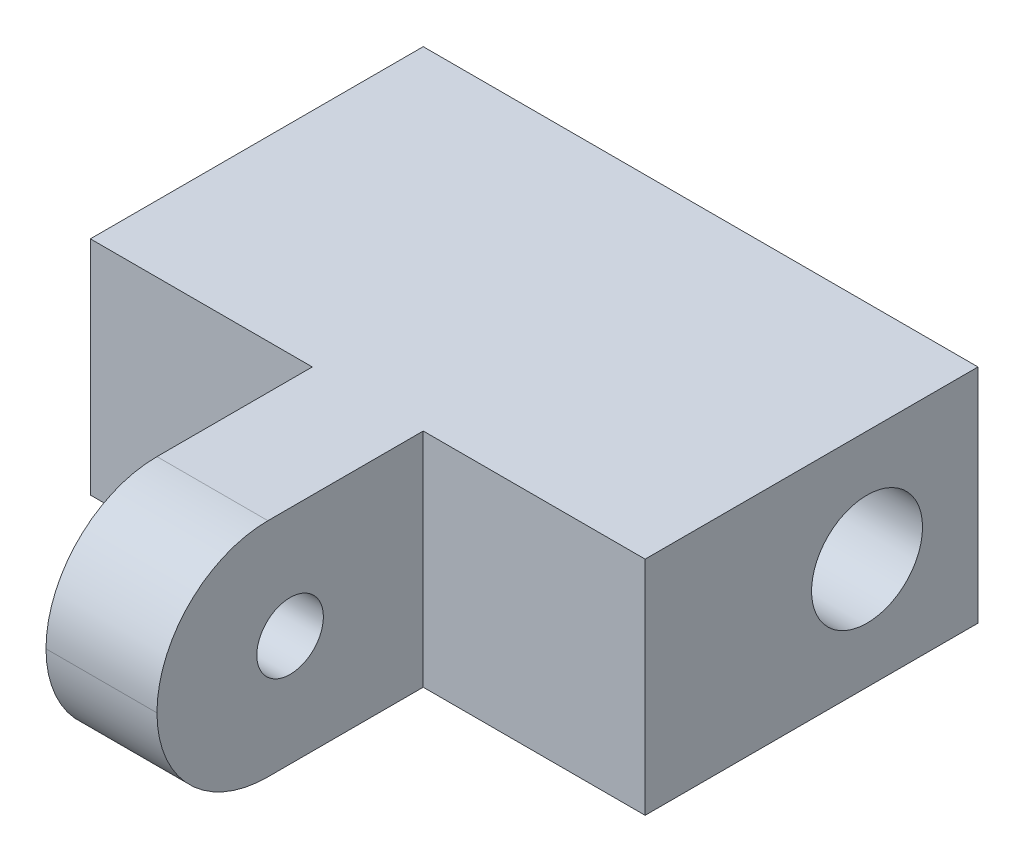
ISO-10303-21;
HEADER;
FILE_DESCRIPTION(('STEP AP214'),'2;1');
FILE_NAME('part.step','',(''),(''),'','','');
FILE_SCHEMA(('AUTOMOTIVE_DESIGN { 1 0 10303 214 1 1 1 1 }'));
ENDSEC;
DATA;
#1=APPLICATION_CONTEXT('core data for automotive mechanical design processes');
#2=APPLICATION_PROTOCOL_DEFINITION('international standard','automotive_design',2000,#1);
#3=PRODUCT_CONTEXT('',#1,'mechanical');
#4=PRODUCT('Part','Part','',(#3));
#5=PRODUCT_RELATED_PRODUCT_CATEGORY('part','',(#4));
#6=PRODUCT_DEFINITION_FORMATION('','',#4);
#7=PRODUCT_DEFINITION_CONTEXT('part definition',#1,'design');
#8=PRODUCT_DEFINITION('design','',#6,#7);
#9=PRODUCT_DEFINITION_SHAPE('','',#8);
#10=(LENGTH_UNIT() NAMED_UNIT(*) SI_UNIT(.MILLI.,.METRE.));
#11=(NAMED_UNIT(*) PLANE_ANGLE_UNIT() SI_UNIT($,.RADIAN.));
#12=(NAMED_UNIT(*) SI_UNIT($,.STERADIAN.) SOLID_ANGLE_UNIT());
#13=UNCERTAINTY_MEASURE_WITH_UNIT(LENGTH_MEASURE(1.E-05),#10,'distance_accuracy_value','');
#14=(GEOMETRIC_REPRESENTATION_CONTEXT(3) GLOBAL_UNCERTAINTY_ASSIGNED_CONTEXT((#13)) GLOBAL_UNIT_ASSIGNED_CONTEXT((#10,
#11,#12)) REPRESENTATION_CONTEXT('',''));
#15=CARTESIAN_POINT('',(0.,0.,0.));
#16=DIRECTION('',(0.,0.,1.));
#17=DIRECTION('',(1.,0.,0.));
#18=AXIS2_PLACEMENT_3D('',#15,#16,#17);
#19=CARTESIAN_POINT('',(12.5,10.,-27.));
#20=DIRECTION('',(-1.,0.,0.));
#21=DIRECTION('',(0.,0.,1.));
#22=AXIS2_PLACEMENT_3D('',#19,#20,#21);
#23=PLANE('',#22);
#24=CARTESIAN_POINT('',(12.5,5.,-22.));
#25=DIRECTION('',(1.,0.,0.));
#26=DIRECTION('',(0.,0.,-1.));
#27=AXIS2_PLACEMENT_3D('',#24,#25,#26);
#28=CIRCLE('',#27,2.5);
#29=CARTESIAN_POINT('',(12.5,5.,-24.5));
#30=VERTEX_POINT('',#29);
#31=EDGE_CURVE('E217',#30,#30,#28,.T.);
#32=ORIENTED_EDGE('',*,*,#31,.F.);
#33=EDGE_LOOP('',(#32));
#34=FACE_BOUND('',#33,.T.);
#35=DIRECTION('',(0.,0.,-1.));
#36=VECTOR('',#35,1.);
#37=CARTESIAN_POINT('',(12.5,0.,-27.));
#38=LINE('',#37,#36);
#39=CARTESIAN_POINT('',(12.5,0.,-12.));
#40=VERTEX_POINT('',#39);
#41=CARTESIAN_POINT('',(12.5,0.,-27.));
#42=VERTEX_POINT('',#41);
#43=EDGE_CURVE('E129',#40,#42,#38,.T.);
#44=ORIENTED_EDGE('',*,*,#43,.T.);
#45=DIRECTION('',(0.,-1.,0.));
#46=VECTOR('',#45,1.);
#47=CARTESIAN_POINT('',(12.5,10.,-27.));
#48=LINE('',#47,#46);
#49=CARTESIAN_POINT('',(12.5,10.,-27.));
#50=VERTEX_POINT('',#49);
#51=EDGE_CURVE('E109',#50,#42,#48,.T.);
#52=ORIENTED_EDGE('',*,*,#51,.F.);
#53=DIRECTION('',(0.,0.,-1.));
#54=VECTOR('',#53,1.);
#55=CARTESIAN_POINT('',(12.5,10.,-27.));
#56=LINE('',#55,#54);
#57=CARTESIAN_POINT('',(12.5,10.,-12.));
#58=VERTEX_POINT('',#57);
#59=EDGE_CURVE('E116',#58,#50,#56,.T.);
#60=ORIENTED_EDGE('',*,*,#59,.F.);
#61=DIRECTION('',(0.,-1.,0.));
#62=VECTOR('',#61,1.);
#63=CARTESIAN_POINT('',(12.5,10.,-12.));
#64=LINE('',#63,#62);
#65=EDGE_CURVE('E227',#58,#40,#64,.T.);
#66=ORIENTED_EDGE('',*,*,#65,.T.);
#67=EDGE_LOOP('',(#44,#52,#60,#66));
#68=FACE_BOUND('',#67,.T.);
#69=ADVANCED_FACE('F33',(#34,#68),#23,.F.);
#70=CARTESIAN_POINT('',(-12.5,10.,-27.));
#71=DIRECTION('',(0.,0.,1.));
#72=DIRECTION('',(1.,0.,0.));
#73=AXIS2_PLACEMENT_3D('',#70,#71,#72);
#74=PLANE('',#73);
#75=DIRECTION('',(-1.,0.,0.));
#76=VECTOR('',#75,1.);
#77=CARTESIAN_POINT('',(-12.5,0.,-27.));
#78=LINE('',#77,#76);
#79=CARTESIAN_POINT('',(-12.5,0.,-27.));
#80=VERTEX_POINT('',#79);
#81=EDGE_CURVE('E229',#42,#80,#78,.T.);
#82=ORIENTED_EDGE('',*,*,#81,.T.);
#83=DIRECTION('',(0.,-1.,0.));
#84=VECTOR('',#83,1.);
#85=CARTESIAN_POINT('',(-12.5,10.,-27.));
#86=LINE('',#85,#84);
#87=CARTESIAN_POINT('',(-12.5,10.,-27.));
#88=VERTEX_POINT('',#87);
#89=EDGE_CURVE('E112',#88,#80,#86,.T.);
#90=ORIENTED_EDGE('',*,*,#89,.F.);
#91=DIRECTION('',(-1.,0.,0.));
#92=VECTOR('',#91,1.);
#93=CARTESIAN_POINT('',(-12.5,10.,-27.));
#94=LINE('',#93,#92);
#95=EDGE_CURVE('E105',#50,#88,#94,.T.);
#96=ORIENTED_EDGE('',*,*,#95,.F.);
#97=ORIENTED_EDGE('',*,*,#51,.T.);
#98=EDGE_LOOP('',(#82,#90,#96,#97));
#99=FACE_BOUND('',#98,.T.);
#100=ADVANCED_FACE('F107',(#99),#74,.F.);
#101=CARTESIAN_POINT('',(-12.5,10.,-12.));
#102=DIRECTION('',(1.,0.,0.));
#103=DIRECTION('',(0.,0.,-1.));
#104=AXIS2_PLACEMENT_3D('',#101,#102,#103);
#105=PLANE('',#104);
#106=CARTESIAN_POINT('',(-12.5,5.,-22.));
#107=DIRECTION('',(1.,0.,0.));
#108=DIRECTION('',(0.,0.,-1.));
#109=AXIS2_PLACEMENT_3D('',#106,#107,#108);
#110=CIRCLE('',#109,2.5);
#111=CARTESIAN_POINT('',(-12.5,5.,-24.5));
#112=VERTEX_POINT('',#111);
#113=EDGE_CURVE('E215',#112,#112,#110,.T.);
#114=ORIENTED_EDGE('',*,*,#113,.T.);
#115=EDGE_LOOP('',(#114));
#116=FACE_BOUND('',#115,.T.);
#117=DIRECTION('',(0.,0.,1.));
#118=VECTOR('',#117,1.);
#119=CARTESIAN_POINT('',(-12.5,0.,-12.));
#120=LINE('',#119,#118);
#121=CARTESIAN_POINT('',(-12.5,0.,-12.));
#122=VERTEX_POINT('',#121);
#123=EDGE_CURVE('E231',#80,#122,#120,.T.);
#124=ORIENTED_EDGE('',*,*,#123,.T.);
#125=DIRECTION('',(0.,-1.,0.));
#126=VECTOR('',#125,1.);
#127=CARTESIAN_POINT('',(-12.5,10.,-12.));
#128=LINE('',#127,#126);
#129=CARTESIAN_POINT('',(-12.5,10.,-12.));
#130=VERTEX_POINT('',#129);
#131=EDGE_CURVE('E135',#130,#122,#128,.T.);
#132=ORIENTED_EDGE('',*,*,#131,.F.);
#133=DIRECTION('',(0.,0.,1.));
#134=VECTOR('',#133,1.);
#135=CARTESIAN_POINT('',(-12.5,10.,-12.));
#136=LINE('',#135,#134);
#137=EDGE_CURVE('E115',#88,#130,#136,.T.);
#138=ORIENTED_EDGE('',*,*,#137,.F.);
#139=ORIENTED_EDGE('',*,*,#89,.T.);
#140=EDGE_LOOP('',(#124,#132,#138,#139));
#141=FACE_BOUND('',#140,.T.);
#142=ADVANCED_FACE('F182',(#116,#141),#105,.F.);
#143=CARTESIAN_POINT('',(-2.5,10.,-12.));
#144=DIRECTION('',(0.,0.,-1.));
#145=DIRECTION('',(-1.,0.,0.));
#146=AXIS2_PLACEMENT_3D('',#143,#144,#145);
#147=PLANE('',#146);
#148=DIRECTION('',(1.,0.,0.));
#149=VECTOR('',#148,1.);
#150=CARTESIAN_POINT('',(-2.5,0.,-12.));
#151=LINE('',#150,#149);
#152=CARTESIAN_POINT('',(-2.5,0.,-12.));
#153=VERTEX_POINT('',#152);
#154=EDGE_CURVE('E233',#122,#153,#151,.T.);
#155=ORIENTED_EDGE('',*,*,#154,.T.);
#156=DIRECTION('',(0.,-1.,0.));
#157=VECTOR('',#156,1.);
#158=CARTESIAN_POINT('',(-2.5,10.,-12.));
#159=LINE('',#158,#157);
#160=CARTESIAN_POINT('',(-2.5,10.,-12.));
#161=VERTEX_POINT('',#160);
#162=EDGE_CURVE('E244',#161,#153,#159,.T.);
#163=ORIENTED_EDGE('',*,*,#162,.F.);
#164=DIRECTION('',(1.,0.,0.));
#165=VECTOR('',#164,1.);
#166=CARTESIAN_POINT('',(-2.5,10.,-12.));
#167=LINE('',#166,#165);
#168=EDGE_CURVE('E157',#130,#161,#167,.T.);
#169=ORIENTED_EDGE('',*,*,#168,.F.);
#170=ORIENTED_EDGE('',*,*,#131,.T.);
#171=EDGE_LOOP('',(#155,#163,#169,#170));
#172=FACE_BOUND('',#171,.T.);
#173=ADVANCED_FACE('F188',(#172),#147,.F.);
#174=CARTESIAN_POINT('',(-2.5,10.,0.));
#175=DIRECTION('',(1.,0.,0.));
#176=DIRECTION('',(0.,0.,-1.));
#177=AXIS2_PLACEMENT_3D('',#174,#175,#176);
#178=PLANE('',#177);
#179=CARTESIAN_POINT('',(-2.5,5.,-6.));
#180=DIRECTION('',(1.,0.,0.));
#181=DIRECTION('',(0.,0.,-1.));
#182=AXIS2_PLACEMENT_3D('',#179,#180,#181);
#183=CIRCLE('',#182,1.5);
#184=CARTESIAN_POINT('',(-2.5,5.,-7.5));
#185=VERTEX_POINT('',#184);
#186=EDGE_CURVE('E141',#185,#185,#183,.T.);
#187=ORIENTED_EDGE('',*,*,#186,.T.);
#188=EDGE_LOOP('',(#187));
#189=FACE_BOUND('',#188,.T.);
#190=CARTESIAN_POINT('',(-2.5,5.,-5.));
#191=DIRECTION('',(1.,0.,0.));
#192=DIRECTION('',(0.,0.,-1.));
#193=AXIS2_PLACEMENT_3D('',#190,#191,#192);
#194=CIRCLE('',#193,5.);
#195=CARTESIAN_POINT('',(-2.5,0.,-5.));
#196=VERTEX_POINT('',#195);
#197=CARTESIAN_POINT('',(-2.5,5.,0.));
#198=VERTEX_POINT('',#197);
#199=EDGE_CURVE('E49',#196,#198,#194,.F.);
#200=ORIENTED_EDGE('',*,*,#199,.T.);
#201=CARTESIAN_POINT('',(-2.5,5.,-5.));
#202=DIRECTION('',(1.,0.,0.));
#203=DIRECTION('',(0.,0.,-1.));
#204=AXIS2_PLACEMENT_3D('',#201,#202,#203);
#205=CIRCLE('',#204,5.);
#206=CARTESIAN_POINT('',(-2.5,10.,-5.));
#207=VERTEX_POINT('',#206);
#208=EDGE_CURVE('E42',#198,#207,#205,.F.);
#209=ORIENTED_EDGE('',*,*,#208,.T.);
#210=DIRECTION('',(0.,0.,1.));
#211=VECTOR('',#210,1.);
#212=CARTESIAN_POINT('',(-2.5,10.,0.));
#213=LINE('',#212,#211);
#214=EDGE_CURVE('E151',#161,#207,#213,.T.);
#215=ORIENTED_EDGE('',*,*,#214,.F.);
#216=ORIENTED_EDGE('',*,*,#162,.T.);
#217=DIRECTION('',(0.,0.,1.));
#218=VECTOR('',#217,1.);
#219=CARTESIAN_POINT('',(-2.5,0.,0.));
#220=LINE('',#219,#218);
#221=EDGE_CURVE('E235',#153,#196,#220,.T.);
#222=ORIENTED_EDGE('',*,*,#221,.T.);
#223=EDGE_LOOP('',(#200,#209,#215,#216,#222));
#224=FACE_BOUND('',#223,.T.);
#225=ADVANCED_FACE('F149',(#189,#224),#178,.F.);
#226=CARTESIAN_POINT('',(2.5,10.,-12.));
#227=DIRECTION('',(-1.,0.,0.));
#228=DIRECTION('',(0.,0.,1.));
#229=AXIS2_PLACEMENT_3D('',#226,#227,#228);
#230=PLANE('',#229);
#231=CARTESIAN_POINT('',(2.5,5.,-6.));
#232=DIRECTION('',(-1.,0.,0.));
#233=DIRECTION('',(0.,0.,1.));
#234=AXIS2_PLACEMENT_3D('',#231,#232,#233);
#235=CIRCLE('',#234,1.5);
#236=CARTESIAN_POINT('',(2.5,5.,-4.5));
#237=VERTEX_POINT('',#236);
#238=EDGE_CURVE('E139',#237,#237,#235,.T.);
#239=ORIENTED_EDGE('',*,*,#238,.T.);
#240=EDGE_LOOP('',(#239));
#241=FACE_BOUND('',#240,.T.);
#242=DIRECTION('',(0.,0.,-1.));
#243=VECTOR('',#242,1.);
#244=CARTESIAN_POINT('',(2.5,10.,-12.));
#245=LINE('',#244,#243);
#246=CARTESIAN_POINT('',(2.5,10.,-5.));
#247=VERTEX_POINT('',#246);
#248=CARTESIAN_POINT('',(2.5,10.,-12.));
#249=VERTEX_POINT('',#248);
#250=EDGE_CURVE('E159',#247,#249,#245,.T.);
#251=ORIENTED_EDGE('',*,*,#250,.F.);
#252=CARTESIAN_POINT('',(2.5,5.,-5.));
#253=DIRECTION('',(-1.,0.,0.));
#254=DIRECTION('',(0.,0.,1.));
#255=AXIS2_PLACEMENT_3D('',#252,#253,#254);
#256=CIRCLE('',#255,5.);
#257=CARTESIAN_POINT('',(2.5,5.,0.));
#258=VERTEX_POINT('',#257);
#259=EDGE_CURVE('E144',#247,#258,#256,.F.);
#260=ORIENTED_EDGE('',*,*,#259,.T.);
#261=CARTESIAN_POINT('',(2.5,5.,-5.));
#262=DIRECTION('',(-1.,0.,0.));
#263=DIRECTION('',(0.,0.,1.));
#264=AXIS2_PLACEMENT_3D('',#261,#262,#263);
#265=CIRCLE('',#264,5.);
#266=CARTESIAN_POINT('',(2.5,0.,-5.));
#267=VERTEX_POINT('',#266);
#268=EDGE_CURVE('E133',#258,#267,#265,.F.);
#269=ORIENTED_EDGE('',*,*,#268,.T.);
#270=DIRECTION('',(0.,0.,-1.));
#271=VECTOR('',#270,1.);
#272=CARTESIAN_POINT('',(2.5,0.,-12.));
#273=LINE('',#272,#271);
#274=CARTESIAN_POINT('',(2.5,0.,-12.));
#275=VERTEX_POINT('',#274);
#276=EDGE_CURVE('E237',#267,#275,#273,.T.);
#277=ORIENTED_EDGE('',*,*,#276,.T.);
#278=DIRECTION('',(0.,-1.,0.));
#279=VECTOR('',#278,1.);
#280=CARTESIAN_POINT('',(2.5,10.,-12.));
#281=LINE('',#280,#279);
#282=EDGE_CURVE('E241',#249,#275,#281,.T.);
#283=ORIENTED_EDGE('',*,*,#282,.F.);
#284=EDGE_LOOP('',(#251,#260,#269,#277,#283));
#285=FACE_BOUND('',#284,.T.);
#286=ADVANCED_FACE('F164',(#241,#285),#230,.F.);
#287=CARTESIAN_POINT('',(12.5,10.,-12.));
#288=DIRECTION('',(0.,0.,-1.));
#289=DIRECTION('',(-1.,0.,0.));
#290=AXIS2_PLACEMENT_3D('',#287,#288,#289);
#291=PLANE('',#290);
#292=DIRECTION('',(1.,0.,0.));
#293=VECTOR('',#292,1.);
#294=CARTESIAN_POINT('',(12.5,0.,-12.));
#295=LINE('',#294,#293);
#296=EDGE_CURVE('E126',#275,#40,#295,.T.);
#297=ORIENTED_EDGE('',*,*,#296,.T.);
#298=ORIENTED_EDGE('',*,*,#65,.F.);
#299=DIRECTION('',(1.,0.,0.));
#300=VECTOR('',#299,1.);
#301=CARTESIAN_POINT('',(12.5,10.,-12.));
#302=LINE('',#301,#300);
#303=EDGE_CURVE('E122',#249,#58,#302,.T.);
#304=ORIENTED_EDGE('',*,*,#303,.F.);
#305=ORIENTED_EDGE('',*,*,#282,.T.);
#306=EDGE_LOOP('',(#297,#298,#304,#305));
#307=FACE_BOUND('',#306,.T.);
#308=ADVANCED_FACE('F198',(#307),#291,.F.);
#309=CARTESIAN_POINT('',(0.,10.,0.));
#310=DIRECTION('',(0.,-1.,0.));
#311=DIRECTION('',(0.,0.,-1.));
#312=AXIS2_PLACEMENT_3D('',#309,#310,#311);
#313=PLANE('',#312);
#314=ORIENTED_EDGE('',*,*,#214,.T.);
#315=DIRECTION('',(1.,0.,0.));
#316=VECTOR('',#315,1.);
#317=CARTESIAN_POINT('',(0.,10.,-5.));
#318=LINE('',#317,#316);
#319=EDGE_CURVE('E130',#207,#247,#318,.T.);
#320=ORIENTED_EDGE('',*,*,#319,.T.);
#321=ORIENTED_EDGE('',*,*,#250,.T.);
#322=ORIENTED_EDGE('',*,*,#303,.T.);
#323=ORIENTED_EDGE('',*,*,#59,.T.);
#324=ORIENTED_EDGE('',*,*,#95,.T.);
#325=ORIENTED_EDGE('',*,*,#137,.T.);
#326=ORIENTED_EDGE('',*,*,#168,.T.);
#327=EDGE_LOOP('',(#314,#320,#321,#322,#323,#324,#325,#326));
#328=FACE_BOUND('',#327,.T.);
#329=ADVANCED_FACE('F120',(#328),#313,.F.);
#330=CARTESIAN_POINT('',(0.,0.,0.));
#331=DIRECTION('',(0.,-1.,0.));
#332=DIRECTION('',(0.,0.,-1.));
#333=AXIS2_PLACEMENT_3D('',#330,#331,#332);
#334=PLANE('',#333);
#335=ORIENTED_EDGE('',*,*,#276,.F.);
#336=DIRECTION('',(1.,0.,0.));
#337=VECTOR('',#336,1.);
#338=CARTESIAN_POINT('',(-2.5,0.,-5.));
#339=LINE('',#338,#337);
#340=EDGE_CURVE('E11',#267,#196,#339,.F.);
#341=ORIENTED_EDGE('',*,*,#340,.T.);
#342=ORIENTED_EDGE('',*,*,#221,.F.);
#343=ORIENTED_EDGE('',*,*,#154,.F.);
#344=ORIENTED_EDGE('',*,*,#123,.F.);
#345=ORIENTED_EDGE('',*,*,#81,.F.);
#346=ORIENTED_EDGE('',*,*,#43,.F.);
#347=ORIENTED_EDGE('',*,*,#296,.F.);
#348=EDGE_LOOP('',(#335,#341,#342,#343,#344,#345,#346,#347));
#349=FACE_BOUND('',#348,.T.);
#350=ADVANCED_FACE('F203',(#349),#334,.T.);
#351=CARTESIAN_POINT('',(-12.5,5.,-22.));
#352=DIRECTION('',(1.,0.,0.));
#353=DIRECTION('',(0.,0.,-1.));
#354=AXIS2_PLACEMENT_3D('',#351,#352,#353);
#355=CYLINDRICAL_SURFACE('',#354,2.5);
#356=ORIENTED_EDGE('',*,*,#113,.F.);
#357=EDGE_LOOP('',(#356));
#358=FACE_BOUND('',#357,.T.);
#359=ORIENTED_EDGE('',*,*,#31,.T.);
#360=EDGE_LOOP('',(#359));
#361=FACE_BOUND('',#360,.T.);
#362=ADVANCED_FACE('F173',(#358,#361),#355,.F.);
#363=CARTESIAN_POINT('',(-12.5,5.,-6.));
#364=DIRECTION('',(1.,0.,0.));
#365=DIRECTION('',(0.,0.,-1.));
#366=AXIS2_PLACEMENT_3D('',#363,#364,#365);
#367=CYLINDRICAL_SURFACE('',#366,1.5);
#368=ORIENTED_EDGE('',*,*,#238,.F.);
#369=EDGE_LOOP('',(#368));
#370=FACE_BOUND('',#369,.T.);
#371=ORIENTED_EDGE('',*,*,#186,.F.);
#372=EDGE_LOOP('',(#371));
#373=FACE_BOUND('',#372,.T.);
#374=ADVANCED_FACE('F168',(#370,#373),#367,.F.);
#375=CARTESIAN_POINT('',(2.5,5.,-5.));
#376=DIRECTION('',(-1.,0.,0.));
#377=DIRECTION('',(0.,0.,1.));
#378=AXIS2_PLACEMENT_3D('',#375,#376,#377);
#379=CYLINDRICAL_SURFACE('',#378,5.);
#380=DIRECTION('',(1.,0.,0.));
#381=VECTOR('',#380,1.);
#382=CARTESIAN_POINT('',(2.5,5.,0.));
#383=LINE('',#382,#381);
#384=EDGE_CURVE('E37',#198,#258,#383,.T.);
#385=ORIENTED_EDGE('',*,*,#384,.F.);
#386=ORIENTED_EDGE('',*,*,#199,.F.);
#387=ORIENTED_EDGE('',*,*,#340,.F.);
#388=ORIENTED_EDGE('',*,*,#268,.F.);
#389=EDGE_LOOP('',(#385,#386,#387,#388));
#390=FACE_BOUND('',#389,.T.);
#391=ADVANCED_FACE('F35',(#390),#379,.T.);
#392=CARTESIAN_POINT('',(0.,5.,-5.));
#393=DIRECTION('',(1.,0.,0.));
#394=DIRECTION('',(0.,0.,-1.));
#395=AXIS2_PLACEMENT_3D('',#392,#393,#394);
#396=CYLINDRICAL_SURFACE('',#395,5.);
#397=ORIENTED_EDGE('',*,*,#208,.F.);
#398=ORIENTED_EDGE('',*,*,#384,.T.);
#399=ORIENTED_EDGE('',*,*,#259,.F.);
#400=ORIENTED_EDGE('',*,*,#319,.F.);
#401=EDGE_LOOP('',(#397,#398,#399,#400));
#402=FACE_BOUND('',#401,.T.);
#403=ADVANCED_FACE('F161',(#402),#396,.T.);
#404=CLOSED_SHELL('',(#69,#100,#142,#173,#225,#286,#308,#329,#350,#362,#374,#391,#403));
#405=MANIFOLD_SOLID_BREP('B2',#404);
#406=ADVANCED_BREP_SHAPE_REPRESENTATION('',(#18,#405),#14);
#407=SHAPE_DEFINITION_REPRESENTATION(#9,#406);
ENDSEC;
END-ISO-10303-21;
